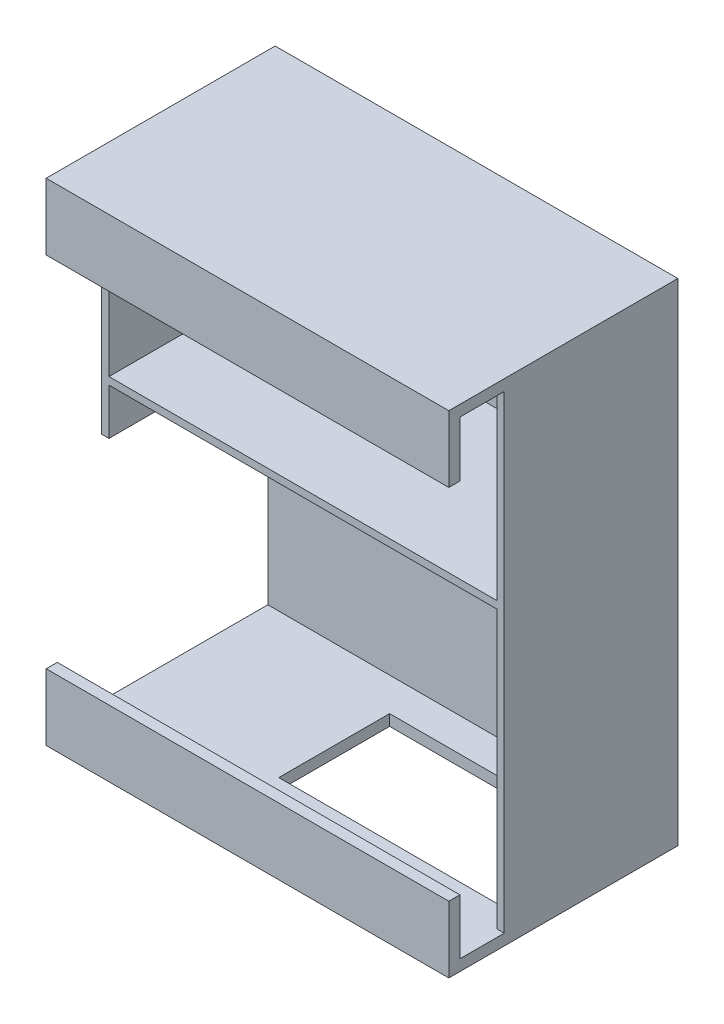
ISO-10303-21;
HEADER;
FILE_DESCRIPTION(('STEP AP214'),'2;1');
FILE_NAME('part.step','',(''),(''),'','','');
FILE_SCHEMA(('AUTOMOTIVE_DESIGN { 1 0 10303 214 1 1 1 1 }'));
ENDSEC;
DATA;
#1=APPLICATION_CONTEXT('core data for automotive mechanical design processes');
#2=APPLICATION_PROTOCOL_DEFINITION('international standard','automotive_design',2000,#1);
#3=PRODUCT_CONTEXT('',#1,'mechanical');
#4=PRODUCT('Part','Part','',(#3));
#5=PRODUCT_RELATED_PRODUCT_CATEGORY('part','',(#4));
#6=PRODUCT_DEFINITION_FORMATION('','',#4);
#7=PRODUCT_DEFINITION_CONTEXT('part definition',#1,'design');
#8=PRODUCT_DEFINITION('design','',#6,#7);
#9=PRODUCT_DEFINITION_SHAPE('','',#8);
#10=(LENGTH_UNIT() NAMED_UNIT(*) SI_UNIT(.MILLI.,.METRE.));
#11=(NAMED_UNIT(*) PLANE_ANGLE_UNIT() SI_UNIT($,.RADIAN.));
#12=(NAMED_UNIT(*) SI_UNIT($,.STERADIAN.) SOLID_ANGLE_UNIT());
#13=UNCERTAINTY_MEASURE_WITH_UNIT(LENGTH_MEASURE(1.E-05),#10,'distance_accuracy_value','');
#14=(GEOMETRIC_REPRESENTATION_CONTEXT(3) GLOBAL_UNCERTAINTY_ASSIGNED_CONTEXT((#13)) GLOBAL_UNIT_ASSIGNED_CONTEXT((#10,
#11,#12)) REPRESENTATION_CONTEXT('',''));
#15=CARTESIAN_POINT('',(0.,0.,0.));
#16=DIRECTION('',(0.,0.,1.));
#17=DIRECTION('',(1.,0.,0.));
#18=AXIS2_PLACEMENT_3D('',#15,#16,#17);
#19=CARTESIAN_POINT('',(52.5,-63.5,2.));
#20=DIRECTION('',(0.,0.,-1.));
#21=DIRECTION('',(-1.,0.,0.));
#22=AXIS2_PLACEMENT_3D('',#19,#20,#21);
#23=PLANE('',#22);
#24=DIRECTION('',(0.,-1.,0.));
#25=VECTOR('',#24,1.);
#26=CARTESIAN_POINT('',(-52.5,1.49999999999998,2.));
#27=LINE('',#26,#25);
#28=CARTESIAN_POINT('',(-52.5,11.5,2.));
#29=VERTEX_POINT('',#28);
#30=CARTESIAN_POINT('',(-52.5,-1.00000000000001,2.));
#31=VERTEX_POINT('',#30);
#32=EDGE_CURVE('E54',#29,#31,#27,.T.);
#33=ORIENTED_EDGE('',*,*,#32,.T.);
#34=DIRECTION('',(1.,0.,0.));
#35=VECTOR('',#34,1.);
#36=CARTESIAN_POINT('',(-54.5,-1.00000000000001,2.));
#37=LINE('',#36,#35);
#38=CARTESIAN_POINT('',(-54.5,-1.00000000000001,2.));
#39=VERTEX_POINT('',#38);
#40=EDGE_CURVE('E58',#39,#31,#37,.T.);
#41=ORIENTED_EDGE('',*,*,#40,.F.);
#42=DIRECTION('',(0.,-1.,0.));
#43=VECTOR('',#42,1.);
#44=CARTESIAN_POINT('',(-54.5,-63.5,2.));
#45=LINE('',#44,#43);
#46=CARTESIAN_POINT('',(-54.5,-63.5,2.));
#47=VERTEX_POINT('',#46);
#48=EDGE_CURVE('E249',#39,#47,#45,.T.);
#49=ORIENTED_EDGE('',*,*,#48,.T.);
#50=DIRECTION('',(-1.,0.,0.));
#51=VECTOR('',#50,1.);
#52=CARTESIAN_POINT('',(52.5,-63.5,2.));
#53=LINE('',#52,#51);
#54=CARTESIAN_POINT('',(52.5,-63.5,2.));
#55=VERTEX_POINT('',#54);
#56=EDGE_CURVE('E373',#55,#47,#53,.T.);
#57=ORIENTED_EDGE('',*,*,#56,.F.);
#58=DIRECTION('',(0.,-1.,0.));
#59=VECTOR('',#58,1.);
#60=CARTESIAN_POINT('',(52.5,-63.5,2.));
#61=LINE('',#60,#59);
#62=CARTESIAN_POINT('',(52.5,11.5,2.));
#63=VERTEX_POINT('',#62);
#64=EDGE_CURVE('E366',#63,#55,#61,.T.);
#65=ORIENTED_EDGE('',*,*,#64,.F.);
#66=DIRECTION('',(-1.,0.,0.));
#67=VECTOR('',#66,1.);
#68=CARTESIAN_POINT('',(52.5,11.5,2.));
#69=LINE('',#68,#67);
#70=EDGE_CURVE('E352',#63,#29,#69,.T.);
#71=ORIENTED_EDGE('',*,*,#70,.T.);
#72=EDGE_LOOP('',(#33,#41,#49,#57,#65,#71));
#73=FACE_BOUND('',#72,.T.);
#74=ADVANCED_FACE('F39',(#73),#23,.F.);
#75=CARTESIAN_POINT('',(54.5,-63.5,59.));
#76=DIRECTION('',(0.,-1.,0.));
#77=DIRECTION('',(0.,0.,-1.));
#78=AXIS2_PLACEMENT_3D('',#75,#76,#77);
#79=PLANE('',#78);
#80=DIRECTION('',(-1.,0.,0.));
#81=VECTOR('',#80,1.);
#82=CARTESIAN_POINT('',(54.5,-63.5,11.0226092691611));
#83=LINE('',#82,#81);
#84=CARTESIAN_POINT('',(52.5,-63.5,11.0226092691611));
#85=VERTEX_POINT('',#84);
#86=CARTESIAN_POINT('',(-12.5,-63.5,11.0226092691611));
#87=VERTEX_POINT('',#86);
#88=EDGE_CURVE('E283',#85,#87,#83,.T.);
#89=ORIENTED_EDGE('',*,*,#88,.F.);
#90=DIRECTION('',(0.,0.,1.));
#91=VECTOR('',#90,1.);
#92=CARTESIAN_POINT('',(52.5,-63.5,47.));
#93=LINE('',#92,#91);
#94=EDGE_CURVE('E370',#55,#85,#93,.T.);
#95=ORIENTED_EDGE('',*,*,#94,.F.);
#96=ORIENTED_EDGE('',*,*,#56,.T.);
#97=DIRECTION('',(0.,0.,1.));
#98=VECTOR('',#97,1.);
#99=CARTESIAN_POINT('',(-54.5,-63.5,59.));
#100=LINE('',#99,#98);
#101=CARTESIAN_POINT('',(-54.5,-63.5,59.));
#102=VERTEX_POINT('',#101);
#103=EDGE_CURVE('E242',#47,#102,#100,.T.);
#104=ORIENTED_EDGE('',*,*,#103,.T.);
#105=DIRECTION('',(-1.,0.,0.));
#106=VECTOR('',#105,1.);
#107=CARTESIAN_POINT('',(54.5,-63.5,59.));
#108=LINE('',#107,#106);
#109=CARTESIAN_POINT('',(54.5,-63.5,59.));
#110=VERTEX_POINT('',#109);
#111=EDGE_CURVE('E398',#110,#102,#108,.T.);
#112=ORIENTED_EDGE('',*,*,#111,.F.);
#113=DIRECTION('',(0.,0.,1.));
#114=VECTOR('',#113,1.);
#115=CARTESIAN_POINT('',(54.5,-63.5,59.));
#116=LINE('',#115,#114);
#117=CARTESIAN_POINT('',(54.5,-63.5,47.));
#118=VERTEX_POINT('',#117);
#119=EDGE_CURVE('E388',#118,#110,#116,.T.);
#120=ORIENTED_EDGE('',*,*,#119,.F.);
#121=DIRECTION('',(-1.,0.,0.));
#122=VECTOR('',#121,1.);
#123=CARTESIAN_POINT('',(54.5,-63.5,47.));
#124=LINE('',#123,#122);
#125=CARTESIAN_POINT('',(52.5,-63.5,47.));
#126=VERTEX_POINT('',#125);
#127=EDGE_CURVE('E401',#118,#126,#124,.T.);
#128=ORIENTED_EDGE('',*,*,#127,.T.);
#129=CARTESIAN_POINT('',(52.5,-63.5,41.0226092691611));
#130=VERTEX_POINT('',#129);
#131=EDGE_CURVE('E369',#130,#126,#93,.T.);
#132=ORIENTED_EDGE('',*,*,#131,.F.);
#133=DIRECTION('',(-1.,0.,0.));
#134=VECTOR('',#133,1.);
#135=CARTESIAN_POINT('',(54.5,-63.5,41.0226092691611));
#136=LINE('',#135,#134);
#137=CARTESIAN_POINT('',(-12.5,-63.5,41.022609269161));
#138=VERTEX_POINT('',#137);
#139=EDGE_CURVE('E274',#130,#138,#136,.T.);
#140=ORIENTED_EDGE('',*,*,#139,.T.);
#141=DIRECTION('',(0.,0.,1.));
#142=VECTOR('',#141,1.);
#143=CARTESIAN_POINT('',(-12.5,-63.5,59.));
#144=LINE('',#143,#142);
#145=EDGE_CURVE('E11',#87,#138,#144,.T.);
#146=ORIENTED_EDGE('',*,*,#145,.F.);
#147=EDGE_LOOP('',(#89,#95,#96,#104,#112,#120,#128,#132,#140,#146));
#148=FACE_BOUND('',#147,.T.);
#149=ADVANCED_FACE('F495',(#148),#79,.F.);
#150=CARTESIAN_POINT('',(0.,0.,2.));
#151=DIRECTION('',(0.,0.,-1.));
#152=DIRECTION('',(-1.,0.,0.));
#153=AXIS2_PLACEMENT_3D('',#150,#151,#152);
#154=PLANE('',#153);
#155=DIRECTION('',(0.,1.,0.));
#156=VECTOR('',#155,1.);
#157=CARTESIAN_POINT('',(52.5,13.5,2.));
#158=LINE('',#157,#156);
#159=CARTESIAN_POINT('',(52.5,13.5,2.));
#160=VERTEX_POINT('',#159);
#161=CARTESIAN_POINT('',(52.5,22.5,2.00000000000002));
#162=VERTEX_POINT('',#161);
#163=EDGE_CURVE('E329',#160,#162,#158,.T.);
#164=ORIENTED_EDGE('',*,*,#163,.T.);
#165=DIRECTION('',(-1.,0.,0.));
#166=VECTOR('',#165,1.);
#167=CARTESIAN_POINT('',(0.,22.5,2.));
#168=LINE('',#167,#166);
#169=CARTESIAN_POINT('',(-52.5,22.5,2.00000000000002));
#170=VERTEX_POINT('',#169);
#171=EDGE_CURVE('E444',#162,#170,#168,.T.);
#172=ORIENTED_EDGE('',*,*,#171,.T.);
#173=DIRECTION('',(0.,-1.,0.));
#174=VECTOR('',#173,1.);
#175=CARTESIAN_POINT('',(-52.5,13.5,2.));
#176=LINE('',#175,#174);
#177=CARTESIAN_POINT('',(-52.5,13.5,2.));
#178=VERTEX_POINT('',#177);
#179=EDGE_CURVE('E325',#170,#178,#176,.T.);
#180=ORIENTED_EDGE('',*,*,#179,.T.);
#181=DIRECTION('',(1.,0.,0.));
#182=VECTOR('',#181,1.);
#183=CARTESIAN_POINT('',(-52.5,13.5,2.));
#184=LINE('',#183,#182);
#185=EDGE_CURVE('E324',#178,#160,#184,.T.);
#186=ORIENTED_EDGE('',*,*,#185,.T.);
#187=EDGE_LOOP('',(#164,#172,#180,#186));
#188=FACE_BOUND('',#187,.T.);
#189=ADVANCED_FACE('F537',(#188),#154,.F.);
#190=CARTESIAN_POINT('',(0.,0.,62.));
#191=DIRECTION('',(0.,0.,-1.));
#192=DIRECTION('',(-1.,0.,0.));
#193=AXIS2_PLACEMENT_3D('',#190,#191,#192);
#194=PLANE('',#193);
#195=DIRECTION('',(0.,-1.,0.));
#196=VECTOR('',#195,1.);
#197=CARTESIAN_POINT('',(-54.5,-66.5,62.));
#198=LINE('',#197,#196);
#199=CARTESIAN_POINT('',(-54.5,66.5,62.));
#200=VERTEX_POINT('',#199);
#201=CARTESIAN_POINT('',(-54.5,48.5,62.));
#202=VERTEX_POINT('',#201);
#203=EDGE_CURVE('E416',#200,#202,#198,.T.);
#204=ORIENTED_EDGE('',*,*,#203,.T.);
#205=DIRECTION('',(-1.,0.,0.));
#206=VECTOR('',#205,1.);
#207=CARTESIAN_POINT('',(137.5,48.5,62.));
#208=LINE('',#207,#206);
#209=CARTESIAN_POINT('',(54.5,48.5,62.));
#210=VERTEX_POINT('',#209);
#211=EDGE_CURVE('E288',#210,#202,#208,.T.);
#212=ORIENTED_EDGE('',*,*,#211,.F.);
#213=DIRECTION('',(0.,1.,0.));
#214=VECTOR('',#213,1.);
#215=CARTESIAN_POINT('',(54.5,-66.5,62.));
#216=LINE('',#215,#214);
#217=CARTESIAN_POINT('',(54.5,66.5,62.));
#218=VERTEX_POINT('',#217);
#219=EDGE_CURVE('E413',#210,#218,#216,.T.);
#220=ORIENTED_EDGE('',*,*,#219,.T.);
#221=DIRECTION('',(-1.,0.,0.));
#222=VECTOR('',#221,1.);
#223=CARTESIAN_POINT('',(-54.5,66.5,62.));
#224=LINE('',#223,#222);
#225=EDGE_CURVE('E412',#218,#200,#224,.T.);
#226=ORIENTED_EDGE('',*,*,#225,.T.);
#227=EDGE_LOOP('',(#204,#212,#220,#226));
#228=FACE_BOUND('',#227,.T.);
#229=ADVANCED_FACE('F468',(#228),#194,.F.);
#230=CARTESIAN_POINT('',(54.5,-66.5,62.));
#231=DIRECTION('',(-1.,0.,0.));
#232=DIRECTION('',(0.,0.,1.));
#233=AXIS2_PLACEMENT_3D('',#230,#231,#232);
#234=PLANE('',#233);
#235=ORIENTED_EDGE('',*,*,#219,.F.);
#236=DIRECTION('',(0.,0.,-1.));
#237=VECTOR('',#236,1.);
#238=CARTESIAN_POINT('',(54.5,48.5,62.));
#239=LINE('',#238,#237);
#240=CARTESIAN_POINT('',(54.5,48.5,59.));
#241=VERTEX_POINT('',#240);
#242=EDGE_CURVE('E297',#210,#241,#239,.T.);
#243=ORIENTED_EDGE('',*,*,#242,.T.);
#244=DIRECTION('',(0.,1.,0.));
#245=VECTOR('',#244,1.);
#246=CARTESIAN_POINT('',(54.5,-63.5,59.));
#247=LINE('',#246,#245);
#248=CARTESIAN_POINT('',(54.5,63.5,59.));
#249=VERTEX_POINT('',#248);
#250=EDGE_CURVE('E382',#241,#249,#247,.T.);
#251=ORIENTED_EDGE('',*,*,#250,.T.);
#252=DIRECTION('',(0.,0.,-1.));
#253=VECTOR('',#252,1.);
#254=CARTESIAN_POINT('',(54.5,63.5,59.));
#255=LINE('',#254,#253);
#256=CARTESIAN_POINT('',(54.5,63.5,47.));
#257=VERTEX_POINT('',#256);
#258=EDGE_CURVE('E381',#249,#257,#255,.T.);
#259=ORIENTED_EDGE('',*,*,#258,.T.);
#260=DIRECTION('',(0.,-1.,0.));
#261=VECTOR('',#260,1.);
#262=CARTESIAN_POINT('',(54.5,-63.5,47.));
#263=LINE('',#262,#261);
#264=EDGE_CURVE('E385',#257,#118,#263,.T.);
#265=ORIENTED_EDGE('',*,*,#264,.T.);
#266=ORIENTED_EDGE('',*,*,#119,.T.);
#267=CARTESIAN_POINT('',(54.5,-48.5,59.));
#268=VERTEX_POINT('',#267);
#269=EDGE_CURVE('E378',#110,#268,#247,.T.);
#270=ORIENTED_EDGE('',*,*,#269,.T.);
#271=DIRECTION('',(0.,0.,1.));
#272=VECTOR('',#271,1.);
#273=CARTESIAN_POINT('',(54.5,-48.5,62.));
#274=LINE('',#273,#272);
#275=CARTESIAN_POINT('',(54.5,-48.5,62.));
#276=VERTEX_POINT('',#275);
#277=EDGE_CURVE('E291',#268,#276,#274,.T.);
#278=ORIENTED_EDGE('',*,*,#277,.T.);
#279=CARTESIAN_POINT('',(54.5,-66.5,62.));
#280=VERTEX_POINT('',#279);
#281=EDGE_CURVE('E409',#280,#276,#216,.T.);
#282=ORIENTED_EDGE('',*,*,#281,.F.);
#283=DIRECTION('',(0.,0.,-1.));
#284=VECTOR('',#283,1.);
#285=CARTESIAN_POINT('',(54.5,-66.5,62.));
#286=LINE('',#285,#284);
#287=CARTESIAN_POINT('',(54.5,-66.5,0.));
#288=VERTEX_POINT('',#287);
#289=EDGE_CURVE('E421',#280,#288,#286,.T.);
#290=ORIENTED_EDGE('',*,*,#289,.T.);
#291=DIRECTION('',(0.,1.,0.));
#292=VECTOR('',#291,1.);
#293=CARTESIAN_POINT('',(54.5,-66.5,0.));
#294=LINE('',#293,#292);
#295=CARTESIAN_POINT('',(54.5,66.5,0.));
#296=VERTEX_POINT('',#295);
#297=EDGE_CURVE('E400',#288,#296,#294,.T.);
#298=ORIENTED_EDGE('',*,*,#297,.T.);
#299=DIRECTION('',(0.,0.,-1.));
#300=VECTOR('',#299,1.);
#301=CARTESIAN_POINT('',(54.5,66.5,62.));
#302=LINE('',#301,#300);
#303=EDGE_CURVE('E438',#218,#296,#302,.T.);
#304=ORIENTED_EDGE('',*,*,#303,.F.);
#305=EDGE_LOOP('',(#235,#243,#251,#259,#265,#266,#270,#278,#282,#290,#298,#304));
#306=FACE_BOUND('',#305,.T.);
#307=ADVANCED_FACE('F41',(#306),#234,.F.);
#308=CARTESIAN_POINT('',(-54.5,66.5,62.));
#309=DIRECTION('',(0.,-1.,0.));
#310=DIRECTION('',(0.,0.,-1.));
#311=AXIS2_PLACEMENT_3D('',#308,#309,#310);
#312=PLANE('',#311);
#313=DIRECTION('',(-1.,0.,0.));
#314=VECTOR('',#313,1.);
#315=CARTESIAN_POINT('',(-54.5,66.5,0.));
#316=LINE('',#315,#314);
#317=CARTESIAN_POINT('',(-54.5,66.5,0.));
#318=VERTEX_POINT('',#317);
#319=EDGE_CURVE('E424',#296,#318,#316,.T.);
#320=ORIENTED_EDGE('',*,*,#319,.T.);
#321=DIRECTION('',(0.,0.,-1.));
#322=VECTOR('',#321,1.);
#323=CARTESIAN_POINT('',(-54.5,66.5,62.));
#324=LINE('',#323,#322);
#325=EDGE_CURVE('E435',#200,#318,#324,.T.);
#326=ORIENTED_EDGE('',*,*,#325,.F.);
#327=ORIENTED_EDGE('',*,*,#225,.F.);
#328=ORIENTED_EDGE('',*,*,#303,.T.);
#329=EDGE_LOOP('',(#320,#326,#327,#328));
#330=FACE_BOUND('',#329,.T.);
#331=ADVANCED_FACE('F555',(#330),#312,.F.);
#332=CARTESIAN_POINT('',(-54.5,-66.5,62.));
#333=DIRECTION('',(1.,0.,0.));
#334=DIRECTION('',(0.,0.,-1.));
#335=AXIS2_PLACEMENT_3D('',#332,#333,#334);
#336=PLANE('',#335);
#337=ORIENTED_EDGE('',*,*,#48,.F.);
#338=DIRECTION('',(0.,0.,-1.));
#339=VECTOR('',#338,1.);
#340=CARTESIAN_POINT('',(-54.5,-1.,47.));
#341=LINE('',#340,#339);
#342=CARTESIAN_POINT('',(-54.5,-1.,47.));
#343=VERTEX_POINT('',#342);
#344=EDGE_CURVE('E246',#343,#39,#341,.T.);
#345=ORIENTED_EDGE('',*,*,#344,.F.);
#346=DIRECTION('',(0.,-1.,0.));
#347=VECTOR('',#346,1.);
#348=CARTESIAN_POINT('',(-54.5,-63.5,47.));
#349=LINE('',#348,#347);
#350=CARTESIAN_POINT('',(-54.5,63.5,47.));
#351=VERTEX_POINT('',#350);
#352=EDGE_CURVE('E229',#351,#343,#349,.T.);
#353=ORIENTED_EDGE('',*,*,#352,.F.);
#354=DIRECTION('',(0.,0.,-1.));
#355=VECTOR('',#354,1.);
#356=CARTESIAN_POINT('',(-54.5,63.5,59.));
#357=LINE('',#356,#355);
#358=CARTESIAN_POINT('',(-54.5,63.5,59.));
#359=VERTEX_POINT('',#358);
#360=EDGE_CURVE('E243',#359,#351,#357,.T.);
#361=ORIENTED_EDGE('',*,*,#360,.F.);
#362=DIRECTION('',(0.,1.,0.));
#363=VECTOR('',#362,1.);
#364=CARTESIAN_POINT('',(-54.5,-63.5,59.));
#365=LINE('',#364,#363);
#366=CARTESIAN_POINT('',(-54.5,48.5,59.));
#367=VERTEX_POINT('',#366);
#368=EDGE_CURVE('E377',#367,#359,#365,.T.);
#369=ORIENTED_EDGE('',*,*,#368,.F.);
#370=DIRECTION('',(0.,0.,-1.));
#371=VECTOR('',#370,1.);
#372=CARTESIAN_POINT('',(-54.5,48.5,59.));
#373=LINE('',#372,#371);
#374=EDGE_CURVE('E286',#202,#367,#373,.T.);
#375=ORIENTED_EDGE('',*,*,#374,.F.);
#376=ORIENTED_EDGE('',*,*,#203,.F.);
#377=ORIENTED_EDGE('',*,*,#325,.T.);
#378=DIRECTION('',(0.,-1.,0.));
#379=VECTOR('',#378,1.);
#380=CARTESIAN_POINT('',(-54.5,-66.5,0.));
#381=LINE('',#380,#379);
#382=CARTESIAN_POINT('',(-54.5,-66.5,0.));
#383=VERTEX_POINT('',#382);
#384=EDGE_CURVE('E426',#318,#383,#381,.T.);
#385=ORIENTED_EDGE('',*,*,#384,.T.);
#386=DIRECTION('',(0.,0.,-1.));
#387=VECTOR('',#386,1.);
#388=CARTESIAN_POINT('',(-54.5,-66.5,62.));
#389=LINE('',#388,#387);
#390=CARTESIAN_POINT('',(-54.5,-66.5,62.));
#391=VERTEX_POINT('',#390);
#392=EDGE_CURVE('E432',#391,#383,#389,.T.);
#393=ORIENTED_EDGE('',*,*,#392,.F.);
#394=CARTESIAN_POINT('',(-54.5,-48.5,62.));
#395=VERTEX_POINT('',#394);
#396=EDGE_CURVE('E415',#395,#391,#198,.T.);
#397=ORIENTED_EDGE('',*,*,#396,.F.);
#398=DIRECTION('',(0.,0.,1.));
#399=VECTOR('',#398,1.);
#400=CARTESIAN_POINT('',(-54.5,-48.5,59.));
#401=LINE('',#400,#399);
#402=CARTESIAN_POINT('',(-54.5,-48.5,59.));
#403=VERTEX_POINT('',#402);
#404=EDGE_CURVE('E289',#403,#395,#401,.T.);
#405=ORIENTED_EDGE('',*,*,#404,.F.);
#406=EDGE_CURVE('E392',#102,#403,#365,.T.);
#407=ORIENTED_EDGE('',*,*,#406,.F.);
#408=ORIENTED_EDGE('',*,*,#103,.F.);
#409=EDGE_LOOP('',(#337,#345,#353,#361,#369,#375,#376,#377,#385,#393,#397,#405,#407,#408));
#410=FACE_BOUND('',#409,.T.);
#411=ADVANCED_FACE('F247',(#410),#336,.F.);
#412=CARTESIAN_POINT('',(-54.5,-66.5,62.));
#413=DIRECTION('',(0.,1.,0.));
#414=DIRECTION('',(0.,0.,1.));
#415=AXIS2_PLACEMENT_3D('',#412,#413,#414);
#416=PLANE('',#415);
#417=DIRECTION('',(-1.,0.,0.));
#418=VECTOR('',#417,1.);
#419=CARTESIAN_POINT('',(52.5,-66.5,41.0226092691611));
#420=LINE('',#419,#418);
#421=CARTESIAN_POINT('',(52.5,-66.5,41.0226092691611));
#422=VERTEX_POINT('',#421);
#423=CARTESIAN_POINT('',(-12.5,-66.5,41.022609269161));
#424=VERTEX_POINT('',#423);
#425=EDGE_CURVE('E262',#422,#424,#420,.T.);
#426=ORIENTED_EDGE('',*,*,#425,.F.);
#427=DIRECTION('',(0.,0.,1.));
#428=VECTOR('',#427,1.);
#429=CARTESIAN_POINT('',(52.5,-66.5,11.0226092691611));
#430=LINE('',#429,#428);
#431=CARTESIAN_POINT('',(52.5,-66.5,11.0226092691611));
#432=VERTEX_POINT('',#431);
#433=EDGE_CURVE('E260',#432,#422,#430,.T.);
#434=ORIENTED_EDGE('',*,*,#433,.F.);
#435=DIRECTION('',(-1.,0.,0.));
#436=VECTOR('',#435,1.);
#437=CARTESIAN_POINT('',(52.5,-66.5,11.0226092691611));
#438=LINE('',#437,#436);
#439=CARTESIAN_POINT('',(-12.5,-66.5,11.0226092691611));
#440=VERTEX_POINT('',#439);
#441=EDGE_CURVE('E268',#432,#440,#438,.T.);
#442=ORIENTED_EDGE('',*,*,#441,.T.);
#443=DIRECTION('',(0.,0.,1.));
#444=VECTOR('',#443,1.);
#445=CARTESIAN_POINT('',(-12.5,-66.5,11.0226092691611));
#446=LINE('',#445,#444);
#447=EDGE_CURVE('E265',#440,#424,#446,.T.);
#448=ORIENTED_EDGE('',*,*,#447,.T.);
#449=EDGE_LOOP('',(#426,#434,#442,#448));
#450=FACE_BOUND('',#449,.T.);
#451=DIRECTION('',(1.,0.,0.));
#452=VECTOR('',#451,1.);
#453=CARTESIAN_POINT('',(-54.5,-66.5,0.));
#454=LINE('',#453,#452);
#455=EDGE_CURVE('E428',#383,#288,#454,.T.);
#456=ORIENTED_EDGE('',*,*,#455,.T.);
#457=ORIENTED_EDGE('',*,*,#289,.F.);
#458=DIRECTION('',(1.,0.,0.));
#459=VECTOR('',#458,1.);
#460=CARTESIAN_POINT('',(-54.5,-66.5,62.));
#461=LINE('',#460,#459);
#462=EDGE_CURVE('E419',#391,#280,#461,.T.);
#463=ORIENTED_EDGE('',*,*,#462,.F.);
#464=ORIENTED_EDGE('',*,*,#392,.T.);
#465=EDGE_LOOP('',(#456,#457,#463,#464));
#466=FACE_BOUND('',#465,.T.);
#467=ADVANCED_FACE('F480',(#450,#466),#416,.F.);
#468=ORIENTED_EDGE('',*,*,#281,.T.);
#469=DIRECTION('',(-1.,0.,0.));
#470=VECTOR('',#469,1.);
#471=CARTESIAN_POINT('',(137.5,-48.5,62.));
#472=LINE('',#471,#470);
#473=EDGE_CURVE('E285',#276,#395,#472,.T.);
#474=ORIENTED_EDGE('',*,*,#473,.T.);
#475=ORIENTED_EDGE('',*,*,#396,.T.);
#476=ORIENTED_EDGE('',*,*,#462,.T.);
#477=EDGE_LOOP('',(#468,#474,#475,#476));
#478=FACE_BOUND('',#477,.T.);
#479=ADVANCED_FACE('F484',(#478),#194,.F.);
#480=CARTESIAN_POINT('',(0.,0.,0.));
#481=DIRECTION('',(0.,0.,-1.));
#482=DIRECTION('',(-1.,0.,0.));
#483=AXIS2_PLACEMENT_3D('',#480,#481,#482);
#484=PLANE('',#483);
#485=DIRECTION('',(0.,1.,0.));
#486=VECTOR('',#485,1.);
#487=CARTESIAN_POINT('',(-52.5,54.5,0.));
#488=LINE('',#487,#486);
#489=CARTESIAN_POINT('',(-52.5,22.5,0.));
#490=VERTEX_POINT('',#489);
#491=CARTESIAN_POINT('',(-52.5,54.5,0.));
#492=VERTEX_POINT('',#491);
#493=EDGE_CURVE('E300',#490,#492,#488,.T.);
#494=ORIENTED_EDGE('',*,*,#493,.F.);
#495=DIRECTION('',(-1.,0.,0.));
#496=VECTOR('',#495,1.);
#497=CARTESIAN_POINT('',(52.5,22.5,0.));
#498=LINE('',#497,#496);
#499=CARTESIAN_POINT('',(52.5,22.5,0.));
#500=VERTEX_POINT('',#499);
#501=EDGE_CURVE('E308',#500,#490,#498,.T.);
#502=ORIENTED_EDGE('',*,*,#501,.F.);
#503=DIRECTION('',(0.,-1.,0.));
#504=VECTOR('',#503,1.);
#505=CARTESIAN_POINT('',(52.5,54.5,0.));
#506=LINE('',#505,#504);
#507=CARTESIAN_POINT('',(52.5,54.5,0.));
#508=VERTEX_POINT('',#507);
#509=EDGE_CURVE('E305',#508,#500,#506,.T.);
#510=ORIENTED_EDGE('',*,*,#509,.F.);
#511=DIRECTION('',(1.,0.,0.));
#512=VECTOR('',#511,1.);
#513=CARTESIAN_POINT('',(52.5,54.5,0.));
#514=LINE('',#513,#512);
#515=EDGE_CURVE('E302',#492,#508,#514,.T.);
#516=ORIENTED_EDGE('',*,*,#515,.F.);
#517=EDGE_LOOP('',(#494,#502,#510,#516));
#518=FACE_BOUND('',#517,.T.);
#519=ORIENTED_EDGE('',*,*,#297,.F.);
#520=ORIENTED_EDGE('',*,*,#455,.F.);
#521=ORIENTED_EDGE('',*,*,#384,.F.);
#522=ORIENTED_EDGE('',*,*,#319,.F.);
#523=EDGE_LOOP('',(#519,#520,#521,#522));
#524=FACE_BOUND('',#523,.T.);
#525=ADVANCED_FACE('F477',(#518,#524),#484,.T.);
#526=CARTESIAN_POINT('',(54.5,-63.5,59.));
#527=DIRECTION('',(0.,0.,1.));
#528=DIRECTION('',(1.,0.,0.));
#529=AXIS2_PLACEMENT_3D('',#526,#527,#528);
#530=PLANE('',#529);
#531=ORIENTED_EDGE('',*,*,#250,.F.);
#532=DIRECTION('',(-1.,0.,0.));
#533=VECTOR('',#532,1.);
#534=CARTESIAN_POINT('',(54.5,48.5,59.));
#535=LINE('',#534,#533);
#536=EDGE_CURVE('E47',#241,#367,#535,.T.);
#537=ORIENTED_EDGE('',*,*,#536,.T.);
#538=ORIENTED_EDGE('',*,*,#368,.T.);
#539=DIRECTION('',(-1.,0.,0.));
#540=VECTOR('',#539,1.);
#541=CARTESIAN_POINT('',(54.5,63.5,59.));
#542=LINE('',#541,#540);
#543=EDGE_CURVE('E391',#249,#359,#542,.T.);
#544=ORIENTED_EDGE('',*,*,#543,.F.);
#545=EDGE_LOOP('',(#531,#537,#538,#544));
#546=FACE_BOUND('',#545,.T.);
#547=ADVANCED_FACE('F453',(#546),#530,.F.);
#548=ORIENTED_EDGE('',*,*,#406,.T.);
#549=DIRECTION('',(1.,0.,0.));
#550=VECTOR('',#549,1.);
#551=CARTESIAN_POINT('',(54.5,-48.5,59.));
#552=LINE('',#551,#550);
#553=EDGE_CURVE('E447',#403,#268,#552,.T.);
#554=ORIENTED_EDGE('',*,*,#553,.T.);
#555=ORIENTED_EDGE('',*,*,#269,.F.);
#556=ORIENTED_EDGE('',*,*,#111,.T.);
#557=EDGE_LOOP('',(#548,#554,#555,#556));
#558=FACE_BOUND('',#557,.T.);
#559=ADVANCED_FACE('F490',(#558),#530,.F.);
#560=CARTESIAN_POINT('',(54.5,-63.5,47.));
#561=DIRECTION('',(0.,0.,-1.));
#562=DIRECTION('',(-1.,0.,0.));
#563=AXIS2_PLACEMENT_3D('',#560,#561,#562);
#564=PLANE('',#563);
#565=DIRECTION('',(1.,0.,0.));
#566=VECTOR('',#565,1.);
#567=CARTESIAN_POINT('',(-52.5,13.5,47.));
#568=LINE('',#567,#566);
#569=CARTESIAN_POINT('',(-52.5,13.5,47.));
#570=VERTEX_POINT('',#569);
#571=CARTESIAN_POINT('',(52.5,13.5,47.));
#572=VERTEX_POINT('',#571);
#573=EDGE_CURVE('E338',#570,#572,#568,.T.);
#574=ORIENTED_EDGE('',*,*,#573,.F.);
#575=DIRECTION('',(0.,-1.,0.));
#576=VECTOR('',#575,1.);
#577=CARTESIAN_POINT('',(-52.5,13.5,47.));
#578=LINE('',#577,#576);
#579=CARTESIAN_POINT('',(-52.5,63.5,47.));
#580=VERTEX_POINT('',#579);
#581=EDGE_CURVE('E314',#580,#570,#578,.T.);
#582=ORIENTED_EDGE('',*,*,#581,.F.);
#583=DIRECTION('',(-1.,0.,0.));
#584=VECTOR('',#583,1.);
#585=CARTESIAN_POINT('',(54.5,63.5,47.));
#586=LINE('',#585,#584);
#587=EDGE_CURVE('E238',#580,#351,#586,.T.);
#588=ORIENTED_EDGE('',*,*,#587,.T.);
#589=ORIENTED_EDGE('',*,*,#352,.T.);
#590=DIRECTION('',(-1.,0.,0.));
#591=VECTOR('',#590,1.);
#592=CARTESIAN_POINT('',(-52.5,-1.,47.));
#593=LINE('',#592,#591);
#594=CARTESIAN_POINT('',(-52.5,-1.,47.));
#595=VERTEX_POINT('',#594);
#596=EDGE_CURVE('E235',#595,#343,#593,.T.);
#597=ORIENTED_EDGE('',*,*,#596,.F.);
#598=DIRECTION('',(0.,-1.,0.));
#599=VECTOR('',#598,1.);
#600=CARTESIAN_POINT('',(-52.5,1.49999999999998,47.));
#601=LINE('',#600,#599);
#602=CARTESIAN_POINT('',(-52.5,11.5,47.));
#603=VERTEX_POINT('',#602);
#604=EDGE_CURVE('E354',#603,#595,#601,.T.);
#605=ORIENTED_EDGE('',*,*,#604,.F.);
#606=DIRECTION('',(-1.,0.,0.));
#607=VECTOR('',#606,1.);
#608=CARTESIAN_POINT('',(52.5,11.5,47.));
#609=LINE('',#608,#607);
#610=CARTESIAN_POINT('',(52.5,11.5,47.));
#611=VERTEX_POINT('',#610);
#612=EDGE_CURVE('E345',#611,#603,#609,.T.);
#613=ORIENTED_EDGE('',*,*,#612,.F.);
#614=DIRECTION('',(0.,1.,0.));
#615=VECTOR('',#614,1.);
#616=CARTESIAN_POINT('',(52.5,-63.5,47.));
#617=LINE('',#616,#615);
#618=EDGE_CURVE('E364',#126,#611,#617,.T.);
#619=ORIENTED_EDGE('',*,*,#618,.F.);
#620=ORIENTED_EDGE('',*,*,#127,.F.);
#621=ORIENTED_EDGE('',*,*,#264,.F.);
#622=CARTESIAN_POINT('',(52.5,63.5,47.));
#623=VERTEX_POINT('',#622);
#624=EDGE_CURVE('E404',#257,#623,#586,.T.);
#625=ORIENTED_EDGE('',*,*,#624,.T.);
#626=DIRECTION('',(0.,1.,0.));
#627=VECTOR('',#626,1.);
#628=CARTESIAN_POINT('',(52.5,13.5,47.));
#629=LINE('',#628,#627);
#630=EDGE_CURVE('E341',#572,#623,#629,.T.);
#631=ORIENTED_EDGE('',*,*,#630,.F.);
#632=EDGE_LOOP('',(#574,#582,#588,#589,#597,#605,#613,#619,#620,#621,#625,#631));
#633=FACE_BOUND('',#632,.T.);
#634=ADVANCED_FACE('F232',(#633),#564,.F.);
#635=CARTESIAN_POINT('',(54.5,63.5,59.));
#636=DIRECTION('',(0.,1.,0.));
#637=DIRECTION('',(0.,0.,1.));
#638=AXIS2_PLACEMENT_3D('',#635,#636,#637);
#639=PLANE('',#638);
#640=ORIENTED_EDGE('',*,*,#360,.T.);
#641=ORIENTED_EDGE('',*,*,#587,.F.);
#642=DIRECTION('',(0.,0.,1.));
#643=VECTOR('',#642,1.);
#644=CARTESIAN_POINT('',(-52.5,63.5,2.));
#645=LINE('',#644,#643);
#646=CARTESIAN_POINT('',(-52.5,63.5,2.));
#647=VERTEX_POINT('',#646);
#648=EDGE_CURVE('E343',#647,#580,#645,.T.);
#649=ORIENTED_EDGE('',*,*,#648,.F.);
#650=DIRECTION('',(-1.,0.,0.));
#651=VECTOR('',#650,1.);
#652=CARTESIAN_POINT('',(-52.5,63.5,2.));
#653=LINE('',#652,#651);
#654=CARTESIAN_POINT('',(52.5,63.5,2.));
#655=VERTEX_POINT('',#654);
#656=EDGE_CURVE('E332',#655,#647,#653,.T.);
#657=ORIENTED_EDGE('',*,*,#656,.F.);
#658=DIRECTION('',(0.,0.,1.));
#659=VECTOR('',#658,1.);
#660=CARTESIAN_POINT('',(52.5,63.5,2.));
#661=LINE('',#660,#659);
#662=EDGE_CURVE('E346',#655,#623,#661,.T.);
#663=ORIENTED_EDGE('',*,*,#662,.T.);
#664=ORIENTED_EDGE('',*,*,#624,.F.);
#665=ORIENTED_EDGE('',*,*,#258,.F.);
#666=ORIENTED_EDGE('',*,*,#543,.T.);
#667=EDGE_LOOP('',(#640,#641,#649,#657,#663,#664,#665,#666));
#668=FACE_BOUND('',#667,.T.);
#669=ADVANCED_FACE('F459',(#668),#639,.F.);
#670=CARTESIAN_POINT('',(52.5,0.,0.));
#671=DIRECTION('',(-1.,0.,0.));
#672=DIRECTION('',(0.,0.,1.));
#673=AXIS2_PLACEMENT_3D('',#670,#671,#672);
#674=PLANE('',#673);
#675=ORIENTED_EDGE('',*,*,#94,.T.);
#676=DIRECTION('',(0.,-1.,0.));
#677=VECTOR('',#676,1.);
#678=CARTESIAN_POINT('',(52.5,-56.5,11.0226092691611));
#679=LINE('',#678,#677);
#680=EDGE_CURVE('E272',#85,#432,#679,.T.);
#681=ORIENTED_EDGE('',*,*,#680,.T.);
#682=ORIENTED_EDGE('',*,*,#433,.T.);
#683=DIRECTION('',(0.,-1.,0.));
#684=VECTOR('',#683,1.);
#685=CARTESIAN_POINT('',(52.5,-56.5,41.0226092691611));
#686=LINE('',#685,#684);
#687=EDGE_CURVE('E271',#130,#422,#686,.T.);
#688=ORIENTED_EDGE('',*,*,#687,.F.);
#689=ORIENTED_EDGE('',*,*,#131,.T.);
#690=ORIENTED_EDGE('',*,*,#618,.T.);
#691=DIRECTION('',(0.,0.,1.));
#692=VECTOR('',#691,1.);
#693=CARTESIAN_POINT('',(52.5,11.5,2.));
#694=LINE('',#693,#692);
#695=EDGE_CURVE('E356',#63,#611,#694,.T.);
#696=ORIENTED_EDGE('',*,*,#695,.F.);
#697=ORIENTED_EDGE('',*,*,#64,.T.);
#698=EDGE_LOOP('',(#675,#681,#682,#688,#689,#690,#696,#697));
#699=FACE_BOUND('',#698,.T.);
#700=ADVANCED_FACE('F499',(#699),#674,.T.);
#701=CARTESIAN_POINT('',(-52.5,1.49999999999998,2.));
#702=DIRECTION('',(-1.,0.,0.));
#703=DIRECTION('',(0.,0.,1.));
#704=AXIS2_PLACEMENT_3D('',#701,#702,#703);
#705=PLANE('',#704);
#706=ORIENTED_EDGE('',*,*,#604,.T.);
#707=DIRECTION('',(0.,0.,1.));
#708=VECTOR('',#707,1.);
#709=CARTESIAN_POINT('',(-52.5,-1.00000000000001,2.));
#710=LINE('',#709,#708);
#711=EDGE_CURVE('E255',#31,#595,#710,.T.);
#712=ORIENTED_EDGE('',*,*,#711,.F.);
#713=ORIENTED_EDGE('',*,*,#32,.F.);
#714=DIRECTION('',(0.,0.,1.));
#715=VECTOR('',#714,1.);
#716=CARTESIAN_POINT('',(-52.5,11.5,2.));
#717=LINE('',#716,#715);
#718=EDGE_CURVE('E360',#29,#603,#717,.T.);
#719=ORIENTED_EDGE('',*,*,#718,.T.);
#720=EDGE_LOOP('',(#706,#712,#713,#719));
#721=FACE_BOUND('',#720,.T.);
#722=ADVANCED_FACE('F506',(#721),#705,.F.);
#723=CARTESIAN_POINT('',(52.5,11.5,2.));
#724=DIRECTION('',(0.,1.,0.));
#725=DIRECTION('',(-1.,0.,0.));
#726=AXIS2_PLACEMENT_3D('',#723,#724,#725);
#727=PLANE('',#726);
#728=ORIENTED_EDGE('',*,*,#612,.T.);
#729=ORIENTED_EDGE('',*,*,#718,.F.);
#730=ORIENTED_EDGE('',*,*,#70,.F.);
#731=ORIENTED_EDGE('',*,*,#695,.T.);
#732=EDGE_LOOP('',(#728,#729,#730,#731));
#733=FACE_BOUND('',#732,.T.);
#734=ADVANCED_FACE('F504',(#733),#727,.F.);
#735=CARTESIAN_POINT('',(-52.5,13.5,2.));
#736=DIRECTION('',(-1.,0.,0.));
#737=DIRECTION('',(0.,0.,1.));
#738=AXIS2_PLACEMENT_3D('',#735,#736,#737);
#739=PLANE('',#738);
#740=DIRECTION('',(0.,0.,-1.));
#741=VECTOR('',#740,1.);
#742=CARTESIAN_POINT('',(-52.5,54.5,45.));
#743=LINE('',#742,#741);
#744=CARTESIAN_POINT('',(-52.5,54.5,2.00000000000002));
#745=VERTEX_POINT('',#744);
#746=EDGE_CURVE('E311',#745,#492,#743,.T.);
#747=ORIENTED_EDGE('',*,*,#746,.F.);
#748=EDGE_CURVE('E321',#647,#745,#176,.T.);
#749=ORIENTED_EDGE('',*,*,#748,.F.);
#750=ORIENTED_EDGE('',*,*,#648,.T.);
#751=ORIENTED_EDGE('',*,*,#581,.T.);
#752=DIRECTION('',(0.,0.,1.));
#753=VECTOR('',#752,1.);
#754=CARTESIAN_POINT('',(-52.5,13.5,2.));
#755=LINE('',#754,#753);
#756=EDGE_CURVE('E335',#178,#570,#755,.T.);
#757=ORIENTED_EDGE('',*,*,#756,.F.);
#758=ORIENTED_EDGE('',*,*,#179,.F.);
#759=DIRECTION('',(0.,0.,-1.));
#760=VECTOR('',#759,1.);
#761=CARTESIAN_POINT('',(-52.5,22.5,45.));
#762=LINE('',#761,#760);
#763=EDGE_CURVE('E312',#170,#490,#762,.T.);
#764=ORIENTED_EDGE('',*,*,#763,.T.);
#765=ORIENTED_EDGE('',*,*,#493,.T.);
#766=EDGE_LOOP('',(#747,#749,#750,#751,#757,#758,#764,#765));
#767=FACE_BOUND('',#766,.T.);
#768=ADVANCED_FACE('F595',(#767),#739,.F.);
#769=CARTESIAN_POINT('',(52.5,13.5,2.));
#770=DIRECTION('',(1.,0.,0.));
#771=DIRECTION('',(0.,0.,-1.));
#772=AXIS2_PLACEMENT_3D('',#769,#770,#771);
#773=PLANE('',#772);
#774=DIRECTION('',(0.,0.,-1.));
#775=VECTOR('',#774,1.);
#776=CARTESIAN_POINT('',(52.5,22.5,45.));
#777=LINE('',#776,#775);
#778=EDGE_CURVE('E315',#162,#500,#777,.T.);
#779=ORIENTED_EDGE('',*,*,#778,.F.);
#780=ORIENTED_EDGE('',*,*,#163,.F.);
#781=DIRECTION('',(0.,0.,1.));
#782=VECTOR('',#781,1.);
#783=CARTESIAN_POINT('',(52.5,13.5,2.));
#784=LINE('',#783,#782);
#785=EDGE_CURVE('E349',#160,#572,#784,.T.);
#786=ORIENTED_EDGE('',*,*,#785,.T.);
#787=ORIENTED_EDGE('',*,*,#630,.T.);
#788=ORIENTED_EDGE('',*,*,#662,.F.);
#789=CARTESIAN_POINT('',(52.5,54.5,2.));
#790=VERTEX_POINT('',#789);
#791=EDGE_CURVE('E328',#790,#655,#158,.T.);
#792=ORIENTED_EDGE('',*,*,#791,.F.);
#793=DIRECTION('',(0.,0.,-1.));
#794=VECTOR('',#793,1.);
#795=CARTESIAN_POINT('',(52.5,54.5,45.));
#796=LINE('',#795,#794);
#797=EDGE_CURVE('E317',#790,#508,#796,.T.);
#798=ORIENTED_EDGE('',*,*,#797,.T.);
#799=ORIENTED_EDGE('',*,*,#509,.T.);
#800=EDGE_LOOP('',(#779,#780,#786,#787,#788,#792,#798,#799));
#801=FACE_BOUND('',#800,.T.);
#802=ADVANCED_FACE('F587',(#801),#773,.F.);
#803=CARTESIAN_POINT('',(-52.5,13.5,2.));
#804=DIRECTION('',(0.,-1.,0.));
#805=DIRECTION('',(1.,0.,0.));
#806=AXIS2_PLACEMENT_3D('',#803,#804,#805);
#807=PLANE('',#806);
#808=ORIENTED_EDGE('',*,*,#573,.T.);
#809=ORIENTED_EDGE('',*,*,#785,.F.);
#810=ORIENTED_EDGE('',*,*,#185,.F.);
#811=ORIENTED_EDGE('',*,*,#756,.T.);
#812=EDGE_LOOP('',(#808,#809,#810,#811));
#813=FACE_BOUND('',#812,.T.);
#814=ADVANCED_FACE('F578',(#813),#807,.F.);
#815=ORIENTED_EDGE('',*,*,#748,.T.);
#816=DIRECTION('',(1.,0.,0.));
#817=VECTOR('',#816,1.);
#818=CARTESIAN_POINT('',(0.,54.5,2.));
#819=LINE('',#818,#817);
#820=EDGE_CURVE('E441',#745,#790,#819,.T.);
#821=ORIENTED_EDGE('',*,*,#820,.T.);
#822=ORIENTED_EDGE('',*,*,#791,.T.);
#823=ORIENTED_EDGE('',*,*,#656,.T.);
#824=EDGE_LOOP('',(#815,#821,#822,#823));
#825=FACE_BOUND('',#824,.T.);
#826=ADVANCED_FACE('F570',(#825),#154,.F.);
#827=CARTESIAN_POINT('',(52.5,22.5,45.));
#828=DIRECTION('',(0.,-1.,0.));
#829=DIRECTION('',(0.,0.,-1.));
#830=AXIS2_PLACEMENT_3D('',#827,#828,#829);
#831=PLANE('',#830);
#832=ORIENTED_EDGE('',*,*,#778,.T.);
#833=ORIENTED_EDGE('',*,*,#501,.T.);
#834=ORIENTED_EDGE('',*,*,#763,.F.);
#835=ORIENTED_EDGE('',*,*,#171,.F.);
#836=EDGE_LOOP('',(#832,#833,#834,#835));
#837=FACE_BOUND('',#836,.T.);
#838=ADVANCED_FACE('F577',(#837),#831,.F.);
#839=CARTESIAN_POINT('',(52.5,54.5,45.));
#840=DIRECTION('',(0.,1.,0.));
#841=DIRECTION('',(0.,0.,1.));
#842=AXIS2_PLACEMENT_3D('',#839,#840,#841);
#843=PLANE('',#842);
#844=ORIENTED_EDGE('',*,*,#746,.T.);
#845=ORIENTED_EDGE('',*,*,#515,.T.);
#846=ORIENTED_EDGE('',*,*,#797,.F.);
#847=ORIENTED_EDGE('',*,*,#820,.F.);
#848=EDGE_LOOP('',(#844,#845,#846,#847));
#849=FACE_BOUND('',#848,.T.);
#850=ADVANCED_FACE('F584',(#849),#843,.F.);
#851=CARTESIAN_POINT('',(137.5,-48.5,59.));
#852=DIRECTION('',(0.,-1.,0.));
#853=DIRECTION('',(0.,0.,-1.));
#854=AXIS2_PLACEMENT_3D('',#851,#852,#853);
#855=PLANE('',#854);
#856=ORIENTED_EDGE('',*,*,#553,.F.);
#857=ORIENTED_EDGE('',*,*,#404,.T.);
#858=ORIENTED_EDGE('',*,*,#473,.F.);
#859=ORIENTED_EDGE('',*,*,#277,.F.);
#860=EDGE_LOOP('',(#856,#857,#858,#859));
#861=FACE_BOUND('',#860,.T.);
#862=ADVANCED_FACE('F665',(#861),#855,.F.);
#863=CARTESIAN_POINT('',(137.5,48.5,59.));
#864=DIRECTION('',(0.,1.,0.));
#865=DIRECTION('',(0.,0.,1.));
#866=AXIS2_PLACEMENT_3D('',#863,#864,#865);
#867=PLANE('',#866);
#868=ORIENTED_EDGE('',*,*,#211,.T.);
#869=ORIENTED_EDGE('',*,*,#374,.T.);
#870=ORIENTED_EDGE('',*,*,#536,.F.);
#871=ORIENTED_EDGE('',*,*,#242,.F.);
#872=EDGE_LOOP('',(#868,#869,#870,#871));
#873=FACE_BOUND('',#872,.T.);
#874=ADVANCED_FACE('F466',(#873),#867,.F.);
#875=CARTESIAN_POINT('',(-12.5,-56.5,11.0226092691611));
#876=DIRECTION('',(1.,0.,0.));
#877=DIRECTION('',(0.,0.,-1.));
#878=AXIS2_PLACEMENT_3D('',#875,#876,#877);
#879=PLANE('',#878);
#880=ORIENTED_EDGE('',*,*,#145,.T.);
#881=DIRECTION('',(0.,-1.,0.));
#882=VECTOR('',#881,1.);
#883=CARTESIAN_POINT('',(-12.5,-56.5,41.022609269161));
#884=LINE('',#883,#882);
#885=EDGE_CURVE('E277',#138,#424,#884,.T.);
#886=ORIENTED_EDGE('',*,*,#885,.T.);
#887=ORIENTED_EDGE('',*,*,#447,.F.);
#888=DIRECTION('',(0.,-1.,0.));
#889=VECTOR('',#888,1.);
#890=CARTESIAN_POINT('',(-12.5,-56.5,11.0226092691611));
#891=LINE('',#890,#889);
#892=EDGE_CURVE('E275',#87,#440,#891,.T.);
#893=ORIENTED_EDGE('',*,*,#892,.F.);
#894=EDGE_LOOP('',(#880,#886,#887,#893));
#895=FACE_BOUND('',#894,.T.);
#896=ADVANCED_FACE('F519',(#895),#879,.T.);
#897=CARTESIAN_POINT('',(52.5,-56.5,11.0226092691611));
#898=DIRECTION('',(0.,0.,1.));
#899=DIRECTION('',(1.,0.,0.));
#900=AXIS2_PLACEMENT_3D('',#897,#898,#899);
#901=PLANE('',#900);
#902=ORIENTED_EDGE('',*,*,#88,.T.);
#903=ORIENTED_EDGE('',*,*,#892,.T.);
#904=ORIENTED_EDGE('',*,*,#441,.F.);
#905=ORIENTED_EDGE('',*,*,#680,.F.);
#906=EDGE_LOOP('',(#902,#903,#904,#905));
#907=FACE_BOUND('',#906,.T.);
#908=ADVANCED_FACE('F521',(#907),#901,.T.);
#909=CARTESIAN_POINT('',(52.5,-56.5,41.0226092691611));
#910=DIRECTION('',(0.,0.,1.));
#911=DIRECTION('',(1.,0.,0.));
#912=AXIS2_PLACEMENT_3D('',#909,#910,#911);
#913=PLANE('',#912);
#914=ORIENTED_EDGE('',*,*,#687,.T.);
#915=ORIENTED_EDGE('',*,*,#425,.T.);
#916=ORIENTED_EDGE('',*,*,#885,.F.);
#917=ORIENTED_EDGE('',*,*,#139,.F.);
#918=EDGE_LOOP('',(#914,#915,#916,#917));
#919=FACE_BOUND('',#918,.T.);
#920=ADVANCED_FACE('F513',(#919),#913,.F.);
#921=CARTESIAN_POINT('',(0.,-1.00000000000001,0.));
#922=DIRECTION('',(0.,-1.,0.));
#923=DIRECTION('',(0.,0.,-1.));
#924=AXIS2_PLACEMENT_3D('',#921,#922,#923);
#925=PLANE('',#924);
#926=ORIENTED_EDGE('',*,*,#596,.T.);
#927=ORIENTED_EDGE('',*,*,#344,.T.);
#928=ORIENTED_EDGE('',*,*,#40,.T.);
#929=ORIENTED_EDGE('',*,*,#711,.T.);
#930=EDGE_LOOP('',(#926,#927,#928,#929));
#931=FACE_BOUND('',#930,.T.);
#932=ADVANCED_FACE('F253',(#931),#925,.T.);
#933=CLOSED_SHELL('',(#74,#149,#189,#229,#307,#331,#411,#467,#479,#525,#547,#559,#634,#669,#700,
#722,#734,#768,#802,#814,#826,#838,#850,#862,#874,#896,#908,#920,#932));
#934=MANIFOLD_SOLID_BREP('B2',#933);
#935=ADVANCED_BREP_SHAPE_REPRESENTATION('',(#18,#934),#14);
#936=SHAPE_DEFINITION_REPRESENTATION(#9,#935);
ENDSEC;
END-ISO-10303-21;
